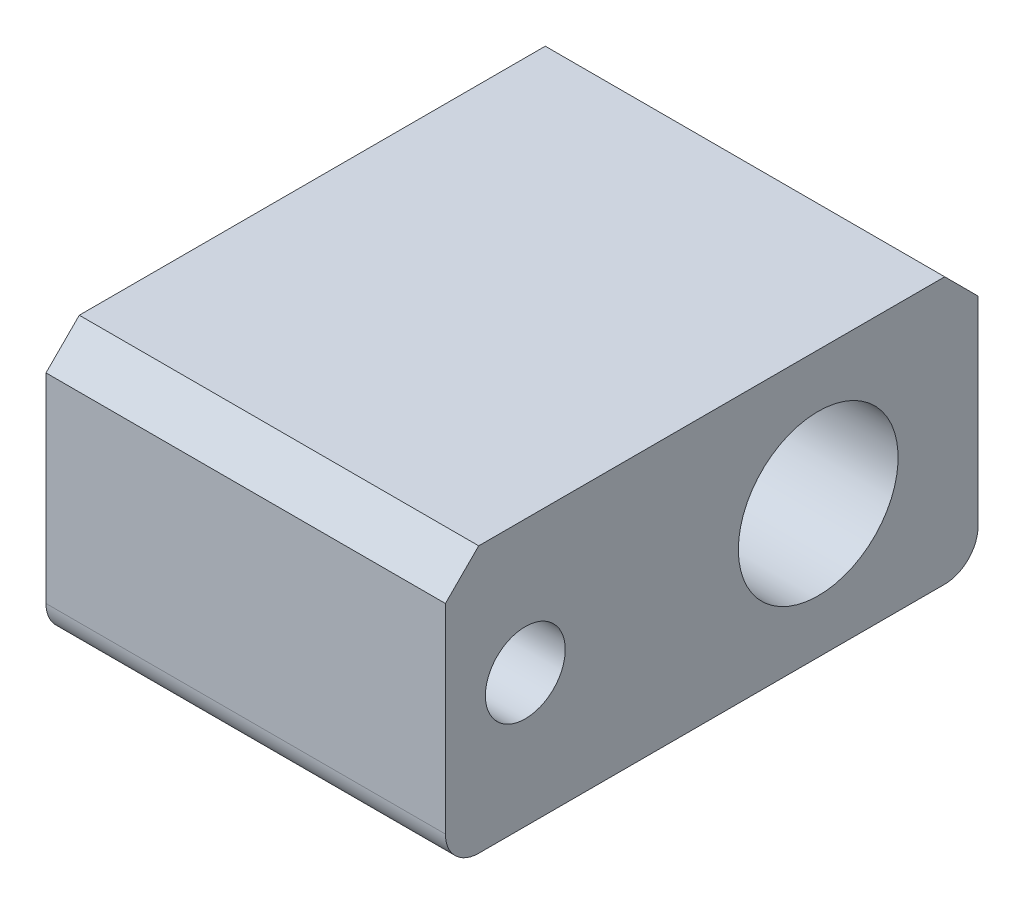
ISO-10303-21;
HEADER;
FILE_DESCRIPTION(('STEP AP214'),'2;1');
FILE_NAME('part.step','',(''),(''),'','','');
FILE_SCHEMA(('AUTOMOTIVE_DESIGN { 1 0 10303 214 1 1 1 1 }'));
ENDSEC;
DATA;
#1=APPLICATION_CONTEXT('core data for automotive mechanical design processes');
#2=APPLICATION_PROTOCOL_DEFINITION('international standard','automotive_design',2000,#1);
#3=PRODUCT_CONTEXT('',#1,'mechanical');
#4=PRODUCT('Part','Part','',(#3));
#5=PRODUCT_RELATED_PRODUCT_CATEGORY('part','',(#4));
#6=PRODUCT_DEFINITION_FORMATION('','',#4);
#7=PRODUCT_DEFINITION_CONTEXT('part definition',#1,'design');
#8=PRODUCT_DEFINITION('design','',#6,#7);
#9=PRODUCT_DEFINITION_SHAPE('','',#8);
#10=(LENGTH_UNIT() NAMED_UNIT(*) SI_UNIT(.MILLI.,.METRE.));
#11=(NAMED_UNIT(*) PLANE_ANGLE_UNIT() SI_UNIT($,.RADIAN.));
#12=(NAMED_UNIT(*) SI_UNIT($,.STERADIAN.) SOLID_ANGLE_UNIT());
#13=UNCERTAINTY_MEASURE_WITH_UNIT(LENGTH_MEASURE(1.E-05),#10,'distance_accuracy_value','');
#14=(GEOMETRIC_REPRESENTATION_CONTEXT(3) GLOBAL_UNCERTAINTY_ASSIGNED_CONTEXT((#13)) GLOBAL_UNIT_ASSIGNED_CONTEXT((#10,
#11,#12)) REPRESENTATION_CONTEXT('',''));
#15=CARTESIAN_POINT('',(0.,0.,0.));
#16=DIRECTION('',(0.,0.,1.));
#17=DIRECTION('',(1.,0.,0.));
#18=AXIS2_PLACEMENT_3D('',#15,#16,#17);
#19=CARTESIAN_POINT('',(76.2,0.,0.));
#20=DIRECTION('',(1.,0.,0.));
#21=DIRECTION('',(0.,0.,-1.));
#22=AXIS2_PLACEMENT_3D('',#19,#20,#21);
#23=PLANE('',#22);
#24=CARTESIAN_POINT('',(76.2,0.,-20.32));
#25=DIRECTION('',(1.,0.,0.));
#26=DIRECTION('',(0.,0.,-1.));
#27=AXIS2_PLACEMENT_3D('',#24,#25,#26);
#28=CIRCLE('',#27,15.24);
#29=CARTESIAN_POINT('',(76.2,0.,-5.08000000000001));
#30=VERTEX_POINT('',#29);
#31=EDGE_CURVE('E150',#30,#30,#28,.T.);
#32=ORIENTED_EDGE('',*,*,#31,.F.);
#33=EDGE_LOOP('',(#32));
#34=FACE_BOUND('',#33,.T.);
#35=DIRECTION('',(0.,1.,0.));
#36=VECTOR('',#35,1.);
#37=CARTESIAN_POINT('',(76.2,25.4,-50.8));
#38=LINE('',#37,#36);
#39=CARTESIAN_POINT('',(76.2,-19.05,-50.8));
#40=VERTEX_POINT('',#39);
#41=CARTESIAN_POINT('',(76.2,19.05,-50.8));
#42=VERTEX_POINT('',#41);
#43=EDGE_CURVE('E133',#40,#42,#38,.T.);
#44=ORIENTED_EDGE('',*,*,#43,.T.);
#45=DIRECTION('',(0.,-0.70710678118655,-0.707106781186545));
#46=VECTOR('',#45,1.);
#47=CARTESIAN_POINT('',(76.2,34.9249999999999,-34.9250000000001));
#48=LINE('',#47,#46);
#49=CARTESIAN_POINT('',(76.2,25.4,-44.45));
#50=VERTEX_POINT('',#49);
#51=EDGE_CURVE('E57',#42,#50,#48,.F.);
#52=ORIENTED_EDGE('',*,*,#51,.T.);
#53=DIRECTION('',(0.,0.,1.));
#54=VECTOR('',#53,1.);
#55=CARTESIAN_POINT('',(76.2,25.4,-50.8));
#56=LINE('',#55,#54);
#57=CARTESIAN_POINT('',(76.2,25.4,44.4499999999999));
#58=VERTEX_POINT('',#57);
#59=EDGE_CURVE('E194',#50,#58,#56,.T.);
#60=ORIENTED_EDGE('',*,*,#59,.T.);
#61=DIRECTION('',(0.,0.707106781186545,-0.70710678118655));
#62=VECTOR('',#61,1.);
#63=CARTESIAN_POINT('',(76.2,34.9250000000001,34.9249999999998));
#64=LINE('',#63,#62);
#65=CARTESIAN_POINT('',(76.2,19.05,50.8));
#66=VERTEX_POINT('',#65);
#67=EDGE_CURVE('E64',#58,#66,#64,.F.);
#68=ORIENTED_EDGE('',*,*,#67,.T.);
#69=DIRECTION('',(0.,-1.,0.));
#70=VECTOR('',#69,1.);
#71=CARTESIAN_POINT('',(76.2,25.4,50.8));
#72=LINE('',#71,#70);
#73=CARTESIAN_POINT('',(76.2,-19.05,50.8));
#74=VERTEX_POINT('',#73);
#75=EDGE_CURVE('E135',#66,#74,#72,.T.);
#76=ORIENTED_EDGE('',*,*,#75,.T.);
#77=CARTESIAN_POINT('',(76.2,-19.05,44.45));
#78=DIRECTION('',(1.,0.,0.));
#79=DIRECTION('',(0.,0.,-1.));
#80=AXIS2_PLACEMENT_3D('',#77,#78,#79);
#81=CIRCLE('',#80,6.35);
#82=CARTESIAN_POINT('',(76.2,-25.4,44.45));
#83=VERTEX_POINT('',#82);
#84=EDGE_CURVE('E165',#74,#83,#81,.T.);
#85=ORIENTED_EDGE('',*,*,#84,.T.);
#86=DIRECTION('',(0.,0.,-1.));
#87=VECTOR('',#86,1.);
#88=CARTESIAN_POINT('',(76.2,-25.4,-50.8));
#89=LINE('',#88,#87);
#90=CARTESIAN_POINT('',(76.2,-25.4,-44.45));
#91=VERTEX_POINT('',#90);
#92=EDGE_CURVE('E155',#83,#91,#89,.T.);
#93=ORIENTED_EDGE('',*,*,#92,.T.);
#94=CARTESIAN_POINT('',(76.2,-19.05,-44.45));
#95=DIRECTION('',(1.,0.,0.));
#96=DIRECTION('',(0.,0.,-1.));
#97=AXIS2_PLACEMENT_3D('',#94,#95,#96);
#98=CIRCLE('',#97,6.35);
#99=EDGE_CURVE('E168',#91,#40,#98,.T.);
#100=ORIENTED_EDGE('',*,*,#99,.T.);
#101=EDGE_LOOP('',(#44,#52,#60,#68,#76,#85,#93,#100));
#102=FACE_BOUND('',#101,.T.);
#103=CARTESIAN_POINT('',(76.2,0.,35.56));
#104=DIRECTION('',(1.,0.,0.));
#105=DIRECTION('',(0.,0.,-1.));
#106=AXIS2_PLACEMENT_3D('',#103,#104,#105);
#107=CIRCLE('',#106,7.62);
#108=CARTESIAN_POINT('',(76.2,0.,43.18));
#109=VERTEX_POINT('',#108);
#110=EDGE_CURVE('E250',#109,#109,#107,.T.);
#111=ORIENTED_EDGE('',*,*,#110,.F.);
#112=EDGE_LOOP('',(#111));
#113=FACE_BOUND('',#112,.T.);
#114=ADVANCED_FACE('F47',(#34,#102,#113),#23,.T.);
#115=CARTESIAN_POINT('',(0.,0.,0.));
#116=DIRECTION('',(1.,0.,0.));
#117=DIRECTION('',(0.,0.,-1.));
#118=AXIS2_PLACEMENT_3D('',#115,#116,#117);
#119=PLANE('',#118);
#120=DIRECTION('',(0.,0.,1.));
#121=VECTOR('',#120,1.);
#122=CARTESIAN_POINT('',(0.,25.4,-50.8));
#123=LINE('',#122,#121);
#124=CARTESIAN_POINT('',(0.,25.4,-44.45));
#125=VERTEX_POINT('',#124);
#126=CARTESIAN_POINT('',(0.,25.4,44.4499999999999));
#127=VERTEX_POINT('',#126);
#128=EDGE_CURVE('E142',#125,#127,#123,.T.);
#129=ORIENTED_EDGE('',*,*,#128,.F.);
#130=DIRECTION('',(0.,0.70710678118655,0.707106781186545));
#131=VECTOR('',#130,1.);
#132=CARTESIAN_POINT('',(0.,25.4,-44.45));
#133=LINE('',#132,#131);
#134=CARTESIAN_POINT('',(0.,19.05,-50.8));
#135=VERTEX_POINT('',#134);
#136=EDGE_CURVE('E140',#125,#135,#133,.F.);
#137=ORIENTED_EDGE('',*,*,#136,.T.);
#138=DIRECTION('',(0.,1.,0.));
#139=VECTOR('',#138,1.);
#140=CARTESIAN_POINT('',(0.,25.4,-50.8));
#141=LINE('',#140,#139);
#142=CARTESIAN_POINT('',(0.,-19.05,-50.8));
#143=VERTEX_POINT('',#142);
#144=EDGE_CURVE('E132',#143,#135,#141,.T.);
#145=ORIENTED_EDGE('',*,*,#144,.F.);
#146=CARTESIAN_POINT('',(0.,-19.05,-44.45));
#147=DIRECTION('',(1.,0.,0.));
#148=DIRECTION('',(0.,0.,-1.));
#149=AXIS2_PLACEMENT_3D('',#146,#147,#148);
#150=CIRCLE('',#149,6.35);
#151=CARTESIAN_POINT('',(0.,-25.4,-44.45));
#152=VERTEX_POINT('',#151);
#153=EDGE_CURVE('E117',#143,#152,#150,.F.);
#154=ORIENTED_EDGE('',*,*,#153,.T.);
#155=DIRECTION('',(0.,0.,-1.));
#156=VECTOR('',#155,1.);
#157=CARTESIAN_POINT('',(0.,-25.4,-50.8));
#158=LINE('',#157,#156);
#159=CARTESIAN_POINT('',(0.,-25.4,44.45));
#160=VERTEX_POINT('',#159);
#161=EDGE_CURVE('E143',#160,#152,#158,.T.);
#162=ORIENTED_EDGE('',*,*,#161,.F.);
#163=CARTESIAN_POINT('',(0.,-19.05,44.45));
#164=DIRECTION('',(1.,0.,0.));
#165=DIRECTION('',(0.,0.,-1.));
#166=AXIS2_PLACEMENT_3D('',#163,#164,#165);
#167=CIRCLE('',#166,6.35);
#168=CARTESIAN_POINT('',(0.,-19.05,50.8));
#169=VERTEX_POINT('',#168);
#170=EDGE_CURVE('E129',#160,#169,#167,.F.);
#171=ORIENTED_EDGE('',*,*,#170,.T.);
#172=DIRECTION('',(0.,-1.,0.));
#173=VECTOR('',#172,1.);
#174=CARTESIAN_POINT('',(0.,25.4,50.8));
#175=LINE('',#174,#173);
#176=CARTESIAN_POINT('',(0.,19.05,50.8));
#177=VERTEX_POINT('',#176);
#178=EDGE_CURVE('E148',#177,#169,#175,.T.);
#179=ORIENTED_EDGE('',*,*,#178,.F.);
#180=DIRECTION('',(0.,-0.707106781186545,0.70710678118655));
#181=VECTOR('',#180,1.);
#182=CARTESIAN_POINT('',(0.,19.05,50.8));
#183=LINE('',#182,#181);
#184=EDGE_CURVE('E182',#177,#127,#183,.F.);
#185=ORIENTED_EDGE('',*,*,#184,.T.);
#186=EDGE_LOOP('',(#129,#137,#145,#154,#162,#171,#179,#185));
#187=FACE_BOUND('',#186,.T.);
#188=CARTESIAN_POINT('',(0.,0.,-20.32));
#189=DIRECTION('',(1.,0.,0.));
#190=DIRECTION('',(0.,0.,-1.));
#191=AXIS2_PLACEMENT_3D('',#188,#189,#190);
#192=CIRCLE('',#191,15.24);
#193=CARTESIAN_POINT('',(0.,0.,-5.08000000000001));
#194=VERTEX_POINT('',#193);
#195=EDGE_CURVE('E258',#194,#194,#192,.T.);
#196=ORIENTED_EDGE('',*,*,#195,.T.);
#197=EDGE_LOOP('',(#196));
#198=FACE_BOUND('',#197,.T.);
#199=CARTESIAN_POINT('',(0.,0.,35.56));
#200=DIRECTION('',(1.,0.,0.));
#201=DIRECTION('',(0.,0.,-1.));
#202=AXIS2_PLACEMENT_3D('',#199,#200,#201);
#203=CIRCLE('',#202,7.62);
#204=CARTESIAN_POINT('',(0.,0.,43.18));
#205=VERTEX_POINT('',#204);
#206=EDGE_CURVE('E253',#205,#205,#203,.T.);
#207=ORIENTED_EDGE('',*,*,#206,.T.);
#208=EDGE_LOOP('',(#207));
#209=FACE_BOUND('',#208,.T.);
#210=ADVANCED_FACE('F138',(#187,#198,#209),#119,.F.);
#211=CARTESIAN_POINT('',(76.2,-25.4,-50.8));
#212=DIRECTION('',(0.,1.,0.));
#213=DIRECTION('',(0.,0.,1.));
#214=AXIS2_PLACEMENT_3D('',#211,#212,#213);
#215=PLANE('',#214);
#216=ORIENTED_EDGE('',*,*,#161,.T.);
#217=DIRECTION('',(-1.,0.,0.));
#218=VECTOR('',#217,1.);
#219=CARTESIAN_POINT('',(76.2,-25.4,-44.45));
#220=LINE('',#219,#218);
#221=EDGE_CURVE('E122',#152,#91,#220,.F.);
#222=ORIENTED_EDGE('',*,*,#221,.T.);
#223=ORIENTED_EDGE('',*,*,#92,.F.);
#224=DIRECTION('',(-1.,0.,0.));
#225=VECTOR('',#224,1.);
#226=CARTESIAN_POINT('',(76.2,-25.4,44.45));
#227=LINE('',#226,#225);
#228=EDGE_CURVE('E128',#83,#160,#227,.T.);
#229=ORIENTED_EDGE('',*,*,#228,.T.);
#230=EDGE_LOOP('',(#216,#222,#223,#229));
#231=FACE_BOUND('',#230,.T.);
#232=ADVANCED_FACE('F220',(#231),#215,.F.);
#233=CARTESIAN_POINT('',(76.2,25.4,-50.8));
#234=DIRECTION('',(0.,0.,1.));
#235=DIRECTION('',(1.,0.,0.));
#236=AXIS2_PLACEMENT_3D('',#233,#234,#235);
#237=PLANE('',#236);
#238=ORIENTED_EDGE('',*,*,#144,.T.);
#239=DIRECTION('',(1.,0.,0.));
#240=VECTOR('',#239,1.);
#241=CARTESIAN_POINT('',(76.2,19.05,-50.8));
#242=LINE('',#241,#240);
#243=EDGE_CURVE('E72',#135,#42,#242,.T.);
#244=ORIENTED_EDGE('',*,*,#243,.T.);
#245=ORIENTED_EDGE('',*,*,#43,.F.);
#246=DIRECTION('',(-1.,0.,0.));
#247=VECTOR('',#246,1.);
#248=CARTESIAN_POINT('',(76.2,-19.05,-50.8));
#249=LINE('',#248,#247);
#250=EDGE_CURVE('E121',#40,#143,#249,.T.);
#251=ORIENTED_EDGE('',*,*,#250,.T.);
#252=EDGE_LOOP('',(#238,#244,#245,#251));
#253=FACE_BOUND('',#252,.T.);
#254=ADVANCED_FACE('F131',(#253),#237,.F.);
#255=CARTESIAN_POINT('',(76.2,25.4,-50.8));
#256=DIRECTION('',(0.,-1.,0.));
#257=DIRECTION('',(0.,0.,-1.));
#258=AXIS2_PLACEMENT_3D('',#255,#256,#257);
#259=PLANE('',#258);
#260=ORIENTED_EDGE('',*,*,#59,.F.);
#261=DIRECTION('',(-1.,0.,0.));
#262=VECTOR('',#261,1.);
#263=CARTESIAN_POINT('',(76.2,25.4,-44.45));
#264=LINE('',#263,#262);
#265=EDGE_CURVE('E178',#50,#125,#264,.T.);
#266=ORIENTED_EDGE('',*,*,#265,.T.);
#267=ORIENTED_EDGE('',*,*,#128,.T.);
#268=DIRECTION('',(1.,0.,0.));
#269=VECTOR('',#268,1.);
#270=CARTESIAN_POINT('',(76.2,25.4,44.4499999999999));
#271=LINE('',#270,#269);
#272=EDGE_CURVE('E175',#127,#58,#271,.T.);
#273=ORIENTED_EDGE('',*,*,#272,.T.);
#274=EDGE_LOOP('',(#260,#266,#267,#273));
#275=FACE_BOUND('',#274,.T.);
#276=ADVANCED_FACE('F198',(#275),#259,.F.);
#277=CARTESIAN_POINT('',(76.2,25.4,50.8));
#278=DIRECTION('',(0.,0.,-1.));
#279=DIRECTION('',(-1.,0.,0.));
#280=AXIS2_PLACEMENT_3D('',#277,#278,#279);
#281=PLANE('',#280);
#282=ORIENTED_EDGE('',*,*,#75,.F.);
#283=DIRECTION('',(-1.,0.,0.));
#284=VECTOR('',#283,1.);
#285=CARTESIAN_POINT('',(76.2,19.05,50.8));
#286=LINE('',#285,#284);
#287=EDGE_CURVE('E11',#66,#177,#286,.T.);
#288=ORIENTED_EDGE('',*,*,#287,.T.);
#289=ORIENTED_EDGE('',*,*,#178,.T.);
#290=DIRECTION('',(-1.,0.,0.));
#291=VECTOR('',#290,1.);
#292=CARTESIAN_POINT('',(76.2,-19.05,50.8));
#293=LINE('',#292,#291);
#294=EDGE_CURVE('E171',#169,#74,#293,.F.);
#295=ORIENTED_EDGE('',*,*,#294,.T.);
#296=EDGE_LOOP('',(#282,#288,#289,#295));
#297=FACE_BOUND('',#296,.T.);
#298=ADVANCED_FACE('F227',(#297),#281,.F.);
#299=CARTESIAN_POINT('',(76.2,0.,-20.32));
#300=DIRECTION('',(-1.,0.,0.));
#301=DIRECTION('',(0.,0.,1.));
#302=AXIS2_PLACEMENT_3D('',#299,#300,#301);
#303=CYLINDRICAL_SURFACE('',#302,15.24);
#304=CARTESIAN_POINT('',(76.2,0.,-5.08000000000001));
#305=CARTESIAN_POINT('',(75.40625,0.,-5.08000000000001));
#306=CARTESIAN_POINT('',(74.6125,0.,-5.08000000000001));
#307=CARTESIAN_POINT('',(73.025,0.,-5.08000000000001));
#308=CARTESIAN_POINT('',(72.23125,0.,-5.08000000000001));
#309=CARTESIAN_POINT('',(70.64375,0.,-5.08000000000001));
#310=CARTESIAN_POINT('',(69.85,0.,-5.08000000000001));
#311=CARTESIAN_POINT('',(68.2625,0.,-5.08000000000001));
#312=CARTESIAN_POINT('',(67.46875,0.,-5.08000000000001));
#313=CARTESIAN_POINT('',(65.88125,0.,-5.08000000000001));
#314=CARTESIAN_POINT('',(65.0875,0.,-5.08000000000001));
#315=CARTESIAN_POINT('',(63.5,0.,-5.08000000000001));
#316=CARTESIAN_POINT('',(62.70625,0.,-5.08000000000001));
#317=CARTESIAN_POINT('',(61.11875,0.,-5.08000000000001));
#318=CARTESIAN_POINT('',(60.325,0.,-5.08000000000001));
#319=CARTESIAN_POINT('',(58.7375,0.,-5.08000000000001));
#320=CARTESIAN_POINT('',(57.94375,0.,-5.08000000000001));
#321=CARTESIAN_POINT('',(56.35625,0.,-5.08000000000001));
#322=CARTESIAN_POINT('',(55.5625,0.,-5.08000000000001));
#323=CARTESIAN_POINT('',(53.975,0.,-5.08000000000001));
#324=CARTESIAN_POINT('',(53.18125,0.,-5.08000000000001));
#325=CARTESIAN_POINT('',(51.59375,0.,-5.08000000000001));
#326=CARTESIAN_POINT('',(50.8,0.,-5.08000000000001));
#327=CARTESIAN_POINT('',(49.2125,0.,-5.08000000000001));
#328=CARTESIAN_POINT('',(48.41875,0.,-5.08000000000001));
#329=CARTESIAN_POINT('',(46.83125,0.,-5.08000000000001));
#330=CARTESIAN_POINT('',(46.0375,0.,-5.08000000000001));
#331=CARTESIAN_POINT('',(44.45,0.,-5.08000000000001));
#332=CARTESIAN_POINT('',(43.65625,0.,-5.08000000000001));
#333=CARTESIAN_POINT('',(42.06875,0.,-5.08000000000001));
#334=CARTESIAN_POINT('',(41.275,0.,-5.08000000000001));
#335=CARTESIAN_POINT('',(39.6875,0.,-5.08000000000001));
#336=CARTESIAN_POINT('',(38.89375,0.,-5.08000000000001));
#337=CARTESIAN_POINT('',(37.30625,0.,-5.08000000000001));
#338=CARTESIAN_POINT('',(36.5125,0.,-5.08000000000001));
#339=CARTESIAN_POINT('',(34.925,0.,-5.08000000000001));
#340=CARTESIAN_POINT('',(34.13125,0.,-5.08000000000001));
#341=CARTESIAN_POINT('',(32.54375,0.,-5.08000000000001));
#342=CARTESIAN_POINT('',(31.75,0.,-5.08000000000001));
#343=CARTESIAN_POINT('',(30.1625,0.,-5.08000000000001));
#344=CARTESIAN_POINT('',(29.36875,0.,-5.08000000000001));
#345=CARTESIAN_POINT('',(27.78125,0.,-5.08000000000001));
#346=CARTESIAN_POINT('',(26.9875,0.,-5.08000000000001));
#347=CARTESIAN_POINT('',(25.4,0.,-5.08000000000001));
#348=CARTESIAN_POINT('',(24.60625,0.,-5.08000000000001));
#349=CARTESIAN_POINT('',(23.01875,0.,-5.08000000000001));
#350=CARTESIAN_POINT('',(22.225,0.,-5.08000000000001));
#351=CARTESIAN_POINT('',(20.6375,0.,-5.08000000000001));
#352=CARTESIAN_POINT('',(19.84375,0.,-5.08000000000001));
#353=CARTESIAN_POINT('',(18.25625,0.,-5.08000000000001));
#354=CARTESIAN_POINT('',(17.4625,0.,-5.08000000000001));
#355=CARTESIAN_POINT('',(15.875,0.,-5.08000000000001));
#356=CARTESIAN_POINT('',(15.08125,0.,-5.08000000000001));
#357=CARTESIAN_POINT('',(13.49375,0.,-5.08000000000001));
#358=CARTESIAN_POINT('',(12.7,0.,-5.08000000000001));
#359=CARTESIAN_POINT('',(11.1125,0.,-5.08000000000001));
#360=CARTESIAN_POINT('',(10.31875,0.,-5.08000000000001));
#361=CARTESIAN_POINT('',(8.73125,0.,-5.08000000000001));
#362=CARTESIAN_POINT('',(7.93750000000001,0.,-5.08000000000001));
#363=CARTESIAN_POINT('',(6.35,0.,-5.08000000000001));
#364=CARTESIAN_POINT('',(5.55625,0.,-5.08000000000001));
#365=CARTESIAN_POINT('',(3.96875,0.,-5.08000000000001));
#366=CARTESIAN_POINT('',(3.175,0.,-5.08000000000001));
#367=CARTESIAN_POINT('',(1.5875,0.,-5.08000000000001));
#368=CARTESIAN_POINT('',(0.793750000000001,0.,-5.08000000000001));
#369=CARTESIAN_POINT('',(0.,0.,-5.08000000000001));
#370=B_SPLINE_CURVE_WITH_KNOTS('',3,(#304,#305,#306,#307,#308,#309,#310,#311,#312,#313,#314,
#315,#316,#317,#318,#319,#320,#321,#322,#323,#324,#325,#326,#327,#328,#329,#330,#331,#332,#333,
#334,#335,#336,#337,#338,#339,#340,#341,#342,#343,#344,#345,#346,#347,#348,#349,#350,#351,#352,
#353,#354,#355,#356,#357,#358,#359,#360,#361,#362,#363,#364,#365,#366,#367,#368,#369),
.UNSPECIFIED.,.F.,.F.,(4,2,2,2,2,2,2,2,2,2,2,2,2,2,2,2,2,2,2,2,2,2,2,2,2,2,2,2,2,2,2,2,4),(0.,
2.38125,4.7625,7.14375,9.52500000000001,11.90625,14.2875,16.66875,19.05,21.43125,23.8125,
26.19375,28.575,30.95625,33.3375,35.71875,38.1,40.48125,42.8625,45.24375,47.625,50.00625,
52.3875,54.76875,57.15,59.53125,61.9125,64.29375,66.675,69.05625,71.4375,73.81875,76.2),.UNSPECIFIED.);
#371=EDGE_CURVE('BSEAM224',#30,#194,#370,.T.);
#372=ORIENTED_EDGE('',*,*,#31,.T.);
#373=ORIENTED_EDGE('',*,*,#195,.F.);
#374=ORIENTED_EDGE('',*,*,#371,.T.);
#375=ORIENTED_EDGE('',*,*,#371,.F.);
#376=EDGE_LOOP('',(#372,#374,#373,#375));
#377=FACE_BOUND('',#376,.T.);
#378=ADVANCED_FACE('F224',(#377),#303,.F.);
#379=CARTESIAN_POINT('',(76.2,0.,35.56));
#380=DIRECTION('',(-1.,0.,0.));
#381=DIRECTION('',(0.,0.,1.));
#382=AXIS2_PLACEMENT_3D('',#379,#380,#381);
#383=CYLINDRICAL_SURFACE('',#382,7.62);
#384=CARTESIAN_POINT('',(76.2,0.,43.18));
#385=CARTESIAN_POINT('',(75.40625,0.,43.18));
#386=CARTESIAN_POINT('',(74.6125,0.,43.18));
#387=CARTESIAN_POINT('',(73.025,0.,43.18));
#388=CARTESIAN_POINT('',(72.23125,0.,43.18));
#389=CARTESIAN_POINT('',(70.64375,0.,43.18));
#390=CARTESIAN_POINT('',(69.85,0.,43.18));
#391=CARTESIAN_POINT('',(68.2625,0.,43.18));
#392=CARTESIAN_POINT('',(67.46875,0.,43.18));
#393=CARTESIAN_POINT('',(65.88125,0.,43.18));
#394=CARTESIAN_POINT('',(65.0875,0.,43.18));
#395=CARTESIAN_POINT('',(63.5,0.,43.18));
#396=CARTESIAN_POINT('',(62.70625,0.,43.18));
#397=CARTESIAN_POINT('',(61.11875,0.,43.18));
#398=CARTESIAN_POINT('',(60.325,0.,43.18));
#399=CARTESIAN_POINT('',(58.7375,0.,43.18));
#400=CARTESIAN_POINT('',(57.94375,0.,43.18));
#401=CARTESIAN_POINT('',(56.35625,0.,43.18));
#402=CARTESIAN_POINT('',(55.5625,0.,43.18));
#403=CARTESIAN_POINT('',(53.975,0.,43.18));
#404=CARTESIAN_POINT('',(53.18125,0.,43.18));
#405=CARTESIAN_POINT('',(51.59375,0.,43.18));
#406=CARTESIAN_POINT('',(50.8,0.,43.18));
#407=CARTESIAN_POINT('',(49.2125,0.,43.18));
#408=CARTESIAN_POINT('',(48.41875,0.,43.18));
#409=CARTESIAN_POINT('',(46.83125,0.,43.18));
#410=CARTESIAN_POINT('',(46.0375,0.,43.18));
#411=CARTESIAN_POINT('',(44.45,0.,43.18));
#412=CARTESIAN_POINT('',(43.65625,0.,43.18));
#413=CARTESIAN_POINT('',(42.06875,0.,43.18));
#414=CARTESIAN_POINT('',(41.275,0.,43.18));
#415=CARTESIAN_POINT('',(39.6875,0.,43.18));
#416=CARTESIAN_POINT('',(38.89375,0.,43.18));
#417=CARTESIAN_POINT('',(37.30625,0.,43.18));
#418=CARTESIAN_POINT('',(36.5125,0.,43.18));
#419=CARTESIAN_POINT('',(34.925,0.,43.18));
#420=CARTESIAN_POINT('',(34.13125,0.,43.18));
#421=CARTESIAN_POINT('',(32.54375,0.,43.18));
#422=CARTESIAN_POINT('',(31.75,0.,43.18));
#423=CARTESIAN_POINT('',(30.1625,0.,43.18));
#424=CARTESIAN_POINT('',(29.36875,0.,43.18));
#425=CARTESIAN_POINT('',(27.78125,0.,43.18));
#426=CARTESIAN_POINT('',(26.9875,0.,43.18));
#427=CARTESIAN_POINT('',(25.4,0.,43.18));
#428=CARTESIAN_POINT('',(24.60625,0.,43.18));
#429=CARTESIAN_POINT('',(23.01875,0.,43.18));
#430=CARTESIAN_POINT('',(22.225,0.,43.18));
#431=CARTESIAN_POINT('',(20.6375,0.,43.18));
#432=CARTESIAN_POINT('',(19.84375,0.,43.18));
#433=CARTESIAN_POINT('',(18.25625,0.,43.18));
#434=CARTESIAN_POINT('',(17.4625,0.,43.18));
#435=CARTESIAN_POINT('',(15.875,0.,43.18));
#436=CARTESIAN_POINT('',(15.08125,0.,43.18));
#437=CARTESIAN_POINT('',(13.49375,0.,43.18));
#438=CARTESIAN_POINT('',(12.7,0.,43.18));
#439=CARTESIAN_POINT('',(11.1125,0.,43.18));
#440=CARTESIAN_POINT('',(10.31875,0.,43.18));
#441=CARTESIAN_POINT('',(8.73125,0.,43.18));
#442=CARTESIAN_POINT('',(7.93750000000001,0.,43.18));
#443=CARTESIAN_POINT('',(6.35,0.,43.18));
#444=CARTESIAN_POINT('',(5.55625,0.,43.18));
#445=CARTESIAN_POINT('',(3.96875,0.,43.18));
#446=CARTESIAN_POINT('',(3.175,0.,43.18));
#447=CARTESIAN_POINT('',(1.5875,0.,43.18));
#448=CARTESIAN_POINT('',(0.793750000000001,0.,43.18));
#449=CARTESIAN_POINT('',(0.,0.,43.18));
#450=B_SPLINE_CURVE_WITH_KNOTS('',3,(#384,#385,#386,#387,#388,#389,#390,#391,#392,#393,#394,
#395,#396,#397,#398,#399,#400,#401,#402,#403,#404,#405,#406,#407,#408,#409,#410,#411,#412,#413,
#414,#415,#416,#417,#418,#419,#420,#421,#422,#423,#424,#425,#426,#427,#428,#429,#430,#431,#432,
#433,#434,#435,#436,#437,#438,#439,#440,#441,#442,#443,#444,#445,#446,#447,#448,#449),
.UNSPECIFIED.,.F.,.F.,(4,2,2,2,2,2,2,2,2,2,2,2,2,2,2,2,2,2,2,2,2,2,2,2,2,2,2,2,2,2,2,2,4),(0.,
2.38125,4.7625,7.14375,9.52500000000001,11.90625,14.2875,16.66875,19.05,21.43125,23.8125,
26.19375,28.575,30.95625,33.3375,35.71875,38.1,40.48125,42.8625,45.24375,47.625,50.00625,
52.3875,54.76875,57.15,59.53125,61.9125,64.29375,66.675,69.05625,71.4375,73.81875,76.2),.UNSPECIFIED.);
#451=EDGE_CURVE('BSEAM238',#109,#205,#450,.T.);
#452=ORIENTED_EDGE('',*,*,#110,.T.);
#453=ORIENTED_EDGE('',*,*,#206,.F.);
#454=ORIENTED_EDGE('',*,*,#451,.T.);
#455=ORIENTED_EDGE('',*,*,#451,.F.);
#456=EDGE_LOOP('',(#452,#454,#453,#455));
#457=FACE_BOUND('',#456,.T.);
#458=ADVANCED_FACE('F238',(#457),#383,.F.);
#459=CARTESIAN_POINT('',(76.2,-19.05,-44.45));
#460=DIRECTION('',(-1.,0.,0.));
#461=DIRECTION('',(0.,0.,1.));
#462=AXIS2_PLACEMENT_3D('',#459,#460,#461);
#463=CYLINDRICAL_SURFACE('',#462,6.35);
#464=ORIENTED_EDGE('',*,*,#99,.F.);
#465=ORIENTED_EDGE('',*,*,#221,.F.);
#466=ORIENTED_EDGE('',*,*,#153,.F.);
#467=ORIENTED_EDGE('',*,*,#250,.F.);
#468=EDGE_LOOP('',(#464,#465,#466,#467));
#469=FACE_BOUND('',#468,.T.);
#470=ADVANCED_FACE('F120',(#469),#463,.T.);
#471=CARTESIAN_POINT('',(76.2,-19.05,44.45));
#472=DIRECTION('',(-1.,0.,0.));
#473=DIRECTION('',(0.,0.,1.));
#474=AXIS2_PLACEMENT_3D('',#471,#472,#473);
#475=CYLINDRICAL_SURFACE('',#474,6.35);
#476=ORIENTED_EDGE('',*,*,#84,.F.);
#477=ORIENTED_EDGE('',*,*,#294,.F.);
#478=ORIENTED_EDGE('',*,*,#170,.F.);
#479=ORIENTED_EDGE('',*,*,#228,.F.);
#480=EDGE_LOOP('',(#476,#477,#478,#479));
#481=FACE_BOUND('',#480,.T.);
#482=ADVANCED_FACE('F204',(#481),#475,.T.);
#483=CARTESIAN_POINT('',(76.2,25.4,-44.45));
#484=DIRECTION('',(0.,-0.707106781186545,0.70710678118655));
#485=DIRECTION('',(-1.,0.,0.));
#486=AXIS2_PLACEMENT_3D('',#483,#484,#485);
#487=PLANE('',#486);
#488=ORIENTED_EDGE('',*,*,#51,.F.);
#489=ORIENTED_EDGE('',*,*,#243,.F.);
#490=ORIENTED_EDGE('',*,*,#136,.F.);
#491=ORIENTED_EDGE('',*,*,#265,.F.);
#492=EDGE_LOOP('',(#488,#489,#490,#491));
#493=FACE_BOUND('',#492,.T.);
#494=ADVANCED_FACE('F202',(#493),#487,.F.);
#495=CARTESIAN_POINT('',(76.2,19.05,50.8));
#496=DIRECTION('',(0.,-0.70710678118655,-0.707106781186545));
#497=DIRECTION('',(-1.,0.,0.));
#498=AXIS2_PLACEMENT_3D('',#495,#496,#497);
#499=PLANE('',#498);
#500=ORIENTED_EDGE('',*,*,#67,.F.);
#501=ORIENTED_EDGE('',*,*,#272,.F.);
#502=ORIENTED_EDGE('',*,*,#184,.F.);
#503=ORIENTED_EDGE('',*,*,#287,.F.);
#504=EDGE_LOOP('',(#500,#501,#502,#503));
#505=FACE_BOUND('',#504,.T.);
#506=ADVANCED_FACE('F50',(#505),#499,.F.);
#507=CLOSED_SHELL('',(#114,#210,#232,#254,#276,#298,#378,#458,#470,#482,#494,#506));
#508=MANIFOLD_SOLID_BREP('B2',#507);
#509=ADVANCED_BREP_SHAPE_REPRESENTATION('',(#18,#508),#14);
#510=SHAPE_DEFINITION_REPRESENTATION(#9,#509);
ENDSEC;
END-ISO-10303-21;
